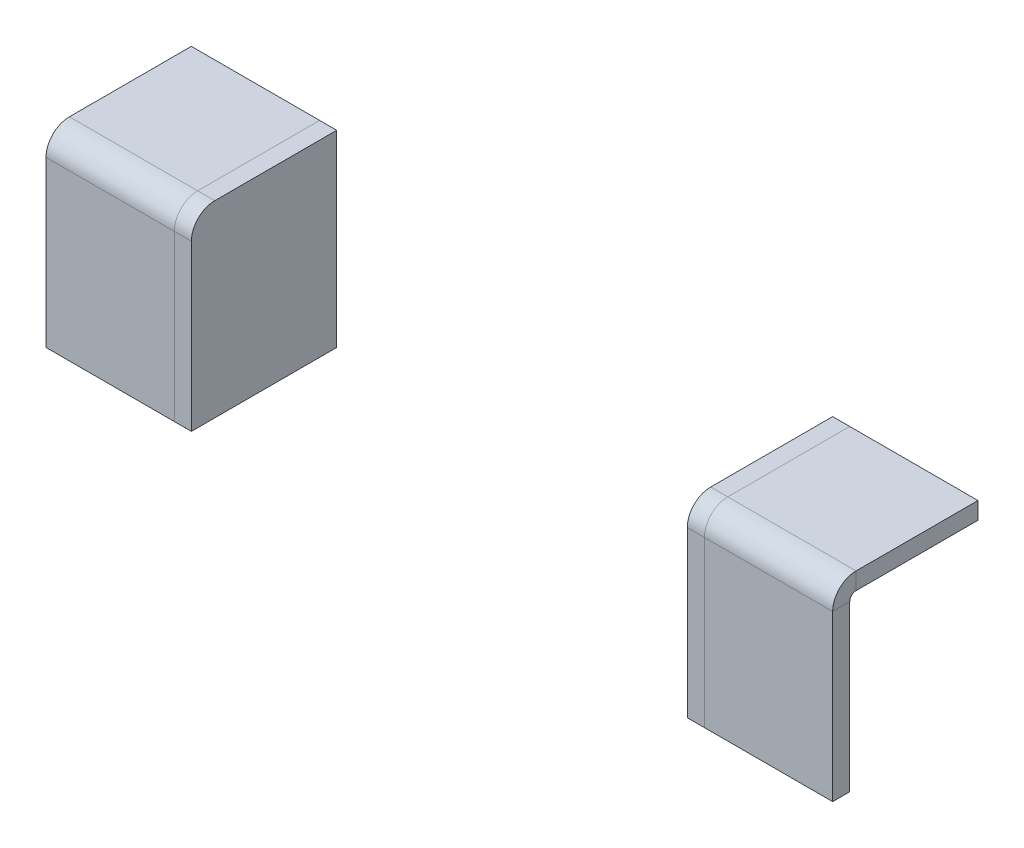
ISO-10303-21;
HEADER;
FILE_DESCRIPTION(('STEP AP214'),'2;1');
FILE_NAME('part.step','',(''),(''),'','','');
FILE_SCHEMA(('AUTOMOTIVE_DESIGN { 1 0 10303 214 1 1 1 1 }'));
ENDSEC;
DATA;
#1=APPLICATION_CONTEXT('core data for automotive mechanical design processes');
#2=APPLICATION_PROTOCOL_DEFINITION('international standard','automotive_design',2000,#1);
#3=PRODUCT_CONTEXT('',#1,'mechanical');
#4=PRODUCT('Part','Part','',(#3));
#5=PRODUCT_RELATED_PRODUCT_CATEGORY('part','',(#4));
#6=PRODUCT_DEFINITION_FORMATION('','',#4);
#7=PRODUCT_DEFINITION_CONTEXT('part definition',#1,'design');
#8=PRODUCT_DEFINITION('design','',#6,#7);
#9=PRODUCT_DEFINITION_SHAPE('','',#8);
#10=(LENGTH_UNIT() NAMED_UNIT(*) SI_UNIT(.MILLI.,.METRE.));
#11=(NAMED_UNIT(*) PLANE_ANGLE_UNIT() SI_UNIT($,.RADIAN.));
#12=(NAMED_UNIT(*) SI_UNIT($,.STERADIAN.) SOLID_ANGLE_UNIT());
#13=UNCERTAINTY_MEASURE_WITH_UNIT(LENGTH_MEASURE(1.E-05),#10,'distance_accuracy_value','');
#14=(GEOMETRIC_REPRESENTATION_CONTEXT(3) GLOBAL_UNCERTAINTY_ASSIGNED_CONTEXT((#13)) GLOBAL_UNIT_ASSIGNED_CONTEXT((#10,
#11,#12)) REPRESENTATION_CONTEXT('',''));
#15=CARTESIAN_POINT('',(0.,0.,0.));
#16=DIRECTION('',(0.,0.,1.));
#17=DIRECTION('',(1.,0.,0.));
#18=AXIS2_PLACEMENT_3D('',#15,#16,#17);
#19=CARTESIAN_POINT('',(67.5,-22.,8.50000000000007));
#20=DIRECTION('',(0.,1.,0.));
#21=DIRECTION('',(0.,0.,1.));
#22=AXIS2_PLACEMENT_3D('',#19,#20,#21);
#23=PLANE('',#22);
#24=DIRECTION('',(0.,0.,-1.));
#25=VECTOR('',#24,1.);
#26=CARTESIAN_POINT('',(69.5,-22.,8.50000000000007));
#27=LINE('',#26,#25);
#28=CARTESIAN_POINT('',(69.5,-22.,8.50000000000007));
#29=VERTEX_POINT('',#28);
#30=CARTESIAN_POINT('',(69.5,-22.,-8.5));
#31=VERTEX_POINT('',#30);
#32=EDGE_CURVE('E144',#29,#31,#27,.T.);
#33=ORIENTED_EDGE('',*,*,#32,.F.);
#34=DIRECTION('',(1.,0.,0.));
#35=VECTOR('',#34,1.);
#36=CARTESIAN_POINT('',(67.5,-22.,8.50000000000007));
#37=LINE('',#36,#35);
#38=CARTESIAN_POINT('',(67.5,-22.,8.50000000000007));
#39=VERTEX_POINT('',#38);
#40=EDGE_CURVE('E143',#39,#29,#37,.T.);
#41=ORIENTED_EDGE('',*,*,#40,.F.);
#42=DIRECTION('',(0.,0.,-1.));
#43=VECTOR('',#42,1.);
#44=CARTESIAN_POINT('',(67.5,-22.,8.50000000000007));
#45=LINE('',#44,#43);
#46=CARTESIAN_POINT('',(67.5,-22.,-8.5));
#47=VERTEX_POINT('',#46);
#48=EDGE_CURVE('E138',#39,#47,#45,.T.);
#49=ORIENTED_EDGE('',*,*,#48,.T.);
#50=DIRECTION('',(1.,0.,0.));
#51=VECTOR('',#50,1.);
#52=CARTESIAN_POINT('',(67.5,-22.,-8.5));
#53=LINE('',#52,#51);
#54=EDGE_CURVE('E14',#47,#31,#53,.T.);
#55=ORIENTED_EDGE('',*,*,#54,.T.);
#56=EDGE_LOOP('',(#33,#41,#49,#55));
#57=FACE_BOUND('',#56,.T.);
#58=ADVANCED_FACE('F69',(#57),#23,.F.);
#59=CARTESIAN_POINT('',(67.5,-22.,-8.5));
#60=DIRECTION('',(0.,0.,1.));
#61=DIRECTION('',(-1.,0.,0.));
#62=AXIS2_PLACEMENT_3D('',#59,#60,#61);
#63=PLANE('',#62);
#64=DIRECTION('',(0.,1.,0.));
#65=VECTOR('',#64,1.);
#66=CARTESIAN_POINT('',(69.5,-22.,-8.5));
#67=LINE('',#66,#65);
#68=CARTESIAN_POINT('',(69.5,0.,-8.5));
#69=VERTEX_POINT('',#68);
#70=EDGE_CURVE('E146',#31,#69,#67,.T.);
#71=ORIENTED_EDGE('',*,*,#70,.F.);
#72=ORIENTED_EDGE('',*,*,#54,.F.);
#73=DIRECTION('',(0.,1.,0.));
#74=VECTOR('',#73,1.);
#75=CARTESIAN_POINT('',(67.5,-22.,-8.5));
#76=LINE('',#75,#74);
#77=CARTESIAN_POINT('',(67.5,0.,-8.5));
#78=VERTEX_POINT('',#77);
#79=EDGE_CURVE('E114',#47,#78,#76,.T.);
#80=ORIENTED_EDGE('',*,*,#79,.T.);
#81=DIRECTION('',(1.,0.,0.));
#82=VECTOR('',#81,1.);
#83=CARTESIAN_POINT('',(67.5,0.,-8.5));
#84=LINE('',#83,#82);
#85=EDGE_CURVE('E77',#78,#69,#84,.T.);
#86=ORIENTED_EDGE('',*,*,#85,.T.);
#87=EDGE_LOOP('',(#71,#72,#80,#86));
#88=FACE_BOUND('',#87,.T.);
#89=ADVANCED_FACE('F155',(#88),#63,.F.);
#90=CARTESIAN_POINT('',(67.5,0.,5.7634));
#91=DIRECTION('',(0.,-1.,0.));
#92=DIRECTION('',(0.,0.,-1.));
#93=AXIS2_PLACEMENT_3D('',#90,#91,#92);
#94=PLANE('',#93);
#95=DIRECTION('',(0.,0.,1.));
#96=VECTOR('',#95,1.);
#97=CARTESIAN_POINT('',(69.5,0.,5.7634));
#98=LINE('',#97,#96);
#99=CARTESIAN_POINT('',(69.5,0.,5.7634));
#100=VERTEX_POINT('',#99);
#101=EDGE_CURVE('E149',#69,#100,#98,.T.);
#102=ORIENTED_EDGE('',*,*,#101,.F.);
#103=ORIENTED_EDGE('',*,*,#85,.F.);
#104=DIRECTION('',(0.,0.,1.));
#105=VECTOR('',#104,1.);
#106=CARTESIAN_POINT('',(67.5,0.,5.7634));
#107=LINE('',#106,#105);
#108=CARTESIAN_POINT('',(67.5,0.,5.7634));
#109=VERTEX_POINT('',#108);
#110=EDGE_CURVE('E123',#78,#109,#107,.T.);
#111=ORIENTED_EDGE('',*,*,#110,.T.);
#112=DIRECTION('',(1.,0.,0.));
#113=VECTOR('',#112,1.);
#114=CARTESIAN_POINT('',(67.5,0.,5.7634));
#115=LINE('',#114,#113);
#116=EDGE_CURVE('E128',#109,#100,#115,.T.);
#117=ORIENTED_EDGE('',*,*,#116,.T.);
#118=EDGE_LOOP('',(#102,#103,#111,#117));
#119=FACE_BOUND('',#118,.T.);
#120=ADVANCED_FACE('F135',(#119),#94,.F.);
#121=CARTESIAN_POINT('',(67.5,-2.7366,5.7634));
#122=DIRECTION('',(1.,0.,0.));
#123=DIRECTION('',(0.,0.,1.));
#124=AXIS2_PLACEMENT_3D('',#121,#122,#123);
#125=CYLINDRICAL_SURFACE('',#124,2.7366);
#126=CARTESIAN_POINT('',(69.5,-2.7366,5.7634));
#127=DIRECTION('',(1.,0.,0.));
#128=DIRECTION('',(0.,0.,-1.));
#129=AXIS2_PLACEMENT_3D('',#126,#127,#128);
#130=CIRCLE('',#129,2.7366);
#131=CARTESIAN_POINT('',(69.5,-2.73659999999999,8.5));
#132=VERTEX_POINT('',#131);
#133=EDGE_CURVE('E130',#100,#132,#130,.T.);
#134=ORIENTED_EDGE('',*,*,#133,.F.);
#135=ORIENTED_EDGE('',*,*,#116,.F.);
#136=CARTESIAN_POINT('',(67.5,-2.7366,5.7634));
#137=DIRECTION('',(1.,0.,0.));
#138=DIRECTION('',(0.,0.,-1.));
#139=AXIS2_PLACEMENT_3D('',#136,#137,#138);
#140=CIRCLE('',#139,2.7366);
#141=CARTESIAN_POINT('',(67.5,-2.73659999999999,8.5));
#142=VERTEX_POINT('',#141);
#143=EDGE_CURVE('E119',#109,#142,#140,.T.);
#144=ORIENTED_EDGE('',*,*,#143,.T.);
#145=DIRECTION('',(1.,0.,0.));
#146=VECTOR('',#145,1.);
#147=CARTESIAN_POINT('',(67.5,-2.73659999999999,8.5));
#148=LINE('',#147,#146);
#149=EDGE_CURVE('E133',#142,#132,#148,.T.);
#150=ORIENTED_EDGE('',*,*,#149,.T.);
#151=EDGE_LOOP('',(#134,#135,#144,#150));
#152=FACE_BOUND('',#151,.T.);
#153=ADVANCED_FACE('F129',(#152),#125,.T.);
#154=CARTESIAN_POINT('',(67.5,-22.,8.50000000000007));
#155=DIRECTION('',(0.,0.,-1.));
#156=DIRECTION('',(0.,1.,0.));
#157=AXIS2_PLACEMENT_3D('',#154,#155,#156);
#158=PLANE('',#157);
#159=DIRECTION('',(0.,-1.,0.));
#160=VECTOR('',#159,1.);
#161=CARTESIAN_POINT('',(69.5,-22.,8.50000000000007));
#162=LINE('',#161,#160);
#163=EDGE_CURVE('E102',#132,#29,#162,.T.);
#164=ORIENTED_EDGE('',*,*,#163,.F.);
#165=ORIENTED_EDGE('',*,*,#149,.F.);
#166=DIRECTION('',(0.,-1.,0.));
#167=VECTOR('',#166,1.);
#168=CARTESIAN_POINT('',(67.5,-22.,8.50000000000007));
#169=LINE('',#168,#167);
#170=EDGE_CURVE('E85',#142,#39,#169,.T.);
#171=ORIENTED_EDGE('',*,*,#170,.T.);
#172=ORIENTED_EDGE('',*,*,#40,.T.);
#173=EDGE_LOOP('',(#164,#165,#171,#172));
#174=FACE_BOUND('',#173,.T.);
#175=ADVANCED_FACE('F161',(#174),#158,.F.);
#176=CARTESIAN_POINT('',(67.5,-2.7366,5.7634));
#177=DIRECTION('',(-1.,0.,0.));
#178=DIRECTION('',(0.,0.,-1.));
#179=AXIS2_PLACEMENT_3D('',#176,#177,#178);
#180=PLANE('',#179);
#181=ORIENTED_EDGE('',*,*,#48,.F.);
#182=ORIENTED_EDGE('',*,*,#170,.F.);
#183=ORIENTED_EDGE('',*,*,#143,.F.);
#184=ORIENTED_EDGE('',*,*,#110,.F.);
#185=ORIENTED_EDGE('',*,*,#79,.F.);
#186=EDGE_LOOP('',(#181,#182,#183,#184,#185));
#187=FACE_BOUND('',#186,.T.);
#188=ADVANCED_FACE('F121',(#187),#180,.T.);
#189=CARTESIAN_POINT('',(69.5,-2.7366,5.7634));
#190=DIRECTION('',(-1.,0.,0.));
#191=DIRECTION('',(0.,0.,-1.));
#192=AXIS2_PLACEMENT_3D('',#189,#190,#191);
#193=PLANE('',#192);
#194=ORIENTED_EDGE('',*,*,#32,.T.);
#195=ORIENTED_EDGE('',*,*,#70,.T.);
#196=ORIENTED_EDGE('',*,*,#101,.T.);
#197=ORIENTED_EDGE('',*,*,#133,.T.);
#198=ORIENTED_EDGE('',*,*,#163,.T.);
#199=EDGE_LOOP('',(#194,#195,#196,#197,#198));
#200=FACE_BOUND('',#199,.T.);
#201=ADVANCED_FACE('F156',(#200),#193,.F.);
#202=CLOSED_SHELL('',(#58,#89,#120,#153,#175,#188,#201));
#203=MANIFOLD_SOLID_BREP('B2',#202);
#204=CARTESIAN_POINT('',(84.5,-2.,8.5));
#205=DIRECTION('',(1.,0.,0.));
#206=DIRECTION('',(0.,0.,1.));
#207=AXIS2_PLACEMENT_3D('',#204,#205,#206);
#208=PLANE('',#207);
#209=DIRECTION('',(0.,0.,1.));
#210=VECTOR('',#209,1.);
#211=CARTESIAN_POINT('',(84.5,-2.,8.5));
#212=LINE('',#211,#210);
#213=CARTESIAN_POINT('',(84.5,-2.,-8.5));
#214=VERTEX_POINT('',#213);
#215=CARTESIAN_POINT('',(84.5,-2.,5.7634));
#216=VERTEX_POINT('',#215);
#217=EDGE_CURVE('E377',#214,#216,#212,.T.);
#218=ORIENTED_EDGE('',*,*,#217,.F.);
#219=DIRECTION('',(0.,1.,0.));
#220=VECTOR('',#219,1.);
#221=CARTESIAN_POINT('',(84.5,-2.,-8.5));
#222=LINE('',#221,#220);
#223=CARTESIAN_POINT('',(84.5,0.,-8.5));
#224=VERTEX_POINT('',#223);
#225=EDGE_CURVE('E67',#214,#224,#222,.T.);
#226=ORIENTED_EDGE('',*,*,#225,.T.);
#227=DIRECTION('',(0.,0.,1.));
#228=VECTOR('',#227,1.);
#229=CARTESIAN_POINT('',(84.5,0.,8.5));
#230=LINE('',#229,#228);
#231=CARTESIAN_POINT('',(84.5,0.,5.7634));
#232=VERTEX_POINT('',#231);
#233=EDGE_CURVE('E375',#224,#232,#230,.T.);
#234=ORIENTED_EDGE('',*,*,#233,.T.);
#235=DIRECTION('',(0.,1.,0.));
#236=VECTOR('',#235,1.);
#237=CARTESIAN_POINT('',(84.5,-2.,5.7634));
#238=LINE('',#237,#236);
#239=EDGE_CURVE('E359',#216,#232,#238,.T.);
#240=ORIENTED_EDGE('',*,*,#239,.F.);
#241=EDGE_LOOP('',(#218,#226,#234,#240));
#242=FACE_BOUND('',#241,.T.);
#243=ADVANCED_FACE('F242',(#242),#208,.T.);
#244=CARTESIAN_POINT('',(77.,-2.,0.));
#245=DIRECTION('',(0.,-1.,0.));
#246=DIRECTION('',(0.,0.,-1.));
#247=AXIS2_PLACEMENT_3D('',#244,#245,#246);
#248=PLANE('',#247);
#249=DIRECTION('',(0.,0.,-1.));
#250=VECTOR('',#249,1.);
#251=CARTESIAN_POINT('',(69.5,-2.,8.5));
#252=LINE('',#251,#250);
#253=CARTESIAN_POINT('',(69.5,-2.,5.7634));
#254=VERTEX_POINT('',#253);
#255=CARTESIAN_POINT('',(69.5,-2.,-8.5));
#256=VERTEX_POINT('',#255);
#257=EDGE_CURVE('E371',#254,#256,#252,.T.);
#258=ORIENTED_EDGE('',*,*,#257,.T.);
#259=DIRECTION('',(1.,0.,0.));
#260=VECTOR('',#259,1.);
#261=CARTESIAN_POINT('',(84.5,-2.,-8.5));
#262=LINE('',#261,#260);
#263=EDGE_CURVE('E374',#256,#214,#262,.T.);
#264=ORIENTED_EDGE('',*,*,#263,.T.);
#265=ORIENTED_EDGE('',*,*,#217,.T.);
#266=DIRECTION('',(1.,0.,0.));
#267=VECTOR('',#266,1.);
#268=CARTESIAN_POINT('',(84.5,-2.,5.7634));
#269=LINE('',#268,#267);
#270=EDGE_CURVE('E362',#216,#254,#269,.F.);
#271=ORIENTED_EDGE('',*,*,#270,.T.);
#272=EDGE_LOOP('',(#258,#264,#265,#271));
#273=FACE_BOUND('',#272,.T.);
#274=ADVANCED_FACE('F409',(#273),#248,.T.);
#275=CARTESIAN_POINT('',(77.,0.,0.));
#276=DIRECTION('',(0.,-1.,0.));
#277=DIRECTION('',(0.,0.,-1.));
#278=AXIS2_PLACEMENT_3D('',#275,#276,#277);
#279=PLANE('',#278);
#280=DIRECTION('',(1.,0.,0.));
#281=VECTOR('',#280,1.);
#282=CARTESIAN_POINT('',(84.5,0.,5.7634));
#283=LINE('',#282,#281);
#284=CARTESIAN_POINT('',(69.5,0.,5.7634));
#285=VERTEX_POINT('',#284);
#286=EDGE_CURVE('E353',#232,#285,#283,.F.);
#287=ORIENTED_EDGE('',*,*,#286,.F.);
#288=ORIENTED_EDGE('',*,*,#233,.F.);
#289=DIRECTION('',(1.,0.,0.));
#290=VECTOR('',#289,1.);
#291=CARTESIAN_POINT('',(84.5,0.,-8.5));
#292=LINE('',#291,#290);
#293=CARTESIAN_POINT('',(69.5,0.,-8.5));
#294=VERTEX_POINT('',#293);
#295=EDGE_CURVE('E382',#294,#224,#292,.T.);
#296=ORIENTED_EDGE('',*,*,#295,.F.);
#297=DIRECTION('',(0.,0.,-1.));
#298=VECTOR('',#297,1.);
#299=CARTESIAN_POINT('',(69.5,0.,8.5));
#300=LINE('',#299,#298);
#301=EDGE_CURVE('E369',#285,#294,#300,.T.);
#302=ORIENTED_EDGE('',*,*,#301,.F.);
#303=EDGE_LOOP('',(#287,#288,#296,#302));
#304=FACE_BOUND('',#303,.T.);
#305=ADVANCED_FACE('F393',(#304),#279,.F.);
#306=CARTESIAN_POINT('',(69.5,-2.,8.5));
#307=DIRECTION('',(-1.,0.,0.));
#308=DIRECTION('',(0.,0.,-1.));
#309=AXIS2_PLACEMENT_3D('',#306,#307,#308);
#310=PLANE('',#309);
#311=DIRECTION('',(0.,1.,0.));
#312=VECTOR('',#311,1.);
#313=CARTESIAN_POINT('',(69.5,-2.,5.7634));
#314=LINE('',#313,#312);
#315=EDGE_CURVE('E366',#254,#285,#314,.T.);
#316=ORIENTED_EDGE('',*,*,#315,.T.);
#317=ORIENTED_EDGE('',*,*,#301,.T.);
#318=DIRECTION('',(0.,1.,0.));
#319=VECTOR('',#318,1.);
#320=CARTESIAN_POINT('',(69.5,-2.,-8.5));
#321=LINE('',#320,#319);
#322=EDGE_CURVE('E246',#256,#294,#321,.T.);
#323=ORIENTED_EDGE('',*,*,#322,.F.);
#324=ORIENTED_EDGE('',*,*,#257,.F.);
#325=EDGE_LOOP('',(#316,#317,#323,#324));
#326=FACE_BOUND('',#325,.T.);
#327=ADVANCED_FACE('F244',(#326),#310,.T.);
#328=CARTESIAN_POINT('',(84.5,-2.,-8.5));
#329=DIRECTION('',(0.,0.,-1.));
#330=DIRECTION('',(1.,0.,0.));
#331=AXIS2_PLACEMENT_3D('',#328,#329,#330);
#332=PLANE('',#331);
#333=ORIENTED_EDGE('',*,*,#295,.T.);
#334=ORIENTED_EDGE('',*,*,#225,.F.);
#335=ORIENTED_EDGE('',*,*,#263,.F.);
#336=ORIENTED_EDGE('',*,*,#322,.T.);
#337=EDGE_LOOP('',(#333,#334,#335,#336));
#338=FACE_BOUND('',#337,.T.);
#339=ADVANCED_FACE('F412',(#338),#332,.T.);
#340=CARTESIAN_POINT('',(69.5,-2.7366,5.7634));
#341=DIRECTION('',(-1.,0.,0.));
#342=DIRECTION('',(0.,0.,-1.));
#343=AXIS2_PLACEMENT_3D('',#340,#341,#342);
#344=PLANE('',#343);
#345=DIRECTION('',(0.,0.,-1.));
#346=VECTOR('',#345,1.);
#347=CARTESIAN_POINT('',(69.5,-2.7366,8.5));
#348=LINE('',#347,#346);
#349=CARTESIAN_POINT('',(69.5,-2.73659999999999,6.5));
#350=VERTEX_POINT('',#349);
#351=CARTESIAN_POINT('',(69.5,-2.73659999999999,8.5));
#352=VERTEX_POINT('',#351);
#353=EDGE_CURVE('E350',#350,#352,#348,.F.);
#354=ORIENTED_EDGE('',*,*,#353,.T.);
#355=CARTESIAN_POINT('',(69.5,-2.7366,5.7634));
#356=DIRECTION('',(-1.,0.,0.));
#357=DIRECTION('',(0.,0.,1.));
#358=AXIS2_PLACEMENT_3D('',#355,#356,#357);
#359=CIRCLE('',#358,2.7366);
#360=EDGE_CURVE('E356',#285,#352,#359,.F.);
#361=ORIENTED_EDGE('',*,*,#360,.F.);
#362=ORIENTED_EDGE('',*,*,#315,.F.);
#363=CARTESIAN_POINT('',(69.5,-2.7366,5.7634));
#364=DIRECTION('',(-1.,0.,0.));
#365=DIRECTION('',(0.,0.,1.));
#366=AXIS2_PLACEMENT_3D('',#363,#364,#365);
#367=CIRCLE('',#366,0.7366);
#368=EDGE_CURVE('E264',#254,#350,#367,.F.);
#369=ORIENTED_EDGE('',*,*,#368,.T.);
#370=EDGE_LOOP('',(#354,#361,#362,#369));
#371=FACE_BOUND('',#370,.T.);
#372=ADVANCED_FACE('F405',(#371),#344,.T.);
#373=CARTESIAN_POINT('',(84.5,-2.7366,5.7634));
#374=DIRECTION('',(-1.,0.,0.));
#375=DIRECTION('',(0.,0.,-1.));
#376=AXIS2_PLACEMENT_3D('',#373,#374,#375);
#377=PLANE('',#376);
#378=CARTESIAN_POINT('',(84.5,-2.7366,5.7634));
#379=DIRECTION('',(-1.,0.,0.));
#380=DIRECTION('',(0.,0.,1.));
#381=AXIS2_PLACEMENT_3D('',#378,#379,#380);
#382=CIRCLE('',#381,0.7366);
#383=CARTESIAN_POINT('',(84.5,-2.73659999999999,6.5));
#384=VERTEX_POINT('',#383);
#385=EDGE_CURVE('E257',#384,#216,#382,.T.);
#386=ORIENTED_EDGE('',*,*,#385,.T.);
#387=ORIENTED_EDGE('',*,*,#239,.T.);
#388=CARTESIAN_POINT('',(84.5,-2.7366,5.7634));
#389=DIRECTION('',(-1.,0.,0.));
#390=DIRECTION('',(0.,0.,1.));
#391=AXIS2_PLACEMENT_3D('',#388,#389,#390);
#392=CIRCLE('',#391,2.7366);
#393=CARTESIAN_POINT('',(84.5,-2.7366,8.5));
#394=VERTEX_POINT('',#393);
#395=EDGE_CURVE('E357',#394,#232,#392,.T.);
#396=ORIENTED_EDGE('',*,*,#395,.F.);
#397=DIRECTION('',(0.,0.,-1.));
#398=VECTOR('',#397,1.);
#399=CARTESIAN_POINT('',(84.5,-2.7366,6.5));
#400=LINE('',#399,#398);
#401=EDGE_CURVE('E344',#384,#394,#400,.F.);
#402=ORIENTED_EDGE('',*,*,#401,.F.);
#403=EDGE_LOOP('',(#386,#387,#396,#402));
#404=FACE_BOUND('',#403,.T.);
#405=ADVANCED_FACE('F397',(#404),#377,.F.);
#406=CARTESIAN_POINT('',(84.5,-2.7366,5.7634));
#407=DIRECTION('',(1.,0.,0.));
#408=DIRECTION('',(0.,0.,1.));
#409=AXIS2_PLACEMENT_3D('',#406,#407,#408);
#410=CYLINDRICAL_SURFACE('',#409,2.7366);
#411=ORIENTED_EDGE('',*,*,#286,.T.);
#412=ORIENTED_EDGE('',*,*,#360,.T.);
#413=DIRECTION('',(1.,0.,0.));
#414=VECTOR('',#413,1.);
#415=CARTESIAN_POINT('',(69.5,-2.7366,8.5));
#416=LINE('',#415,#414);
#417=EDGE_CURVE('E326',#394,#352,#416,.F.);
#418=ORIENTED_EDGE('',*,*,#417,.F.);
#419=ORIENTED_EDGE('',*,*,#395,.T.);
#420=EDGE_LOOP('',(#411,#412,#418,#419));
#421=FACE_BOUND('',#420,.T.);
#422=ADVANCED_FACE('F398',(#421),#410,.T.);
#423=CARTESIAN_POINT('',(84.5,-2.7366,5.7634));
#424=DIRECTION('',(1.,0.,0.));
#425=DIRECTION('',(0.,0.,1.));
#426=AXIS2_PLACEMENT_3D('',#423,#424,#425);
#427=CYLINDRICAL_SURFACE('',#426,0.7366);
#428=ORIENTED_EDGE('',*,*,#270,.F.);
#429=ORIENTED_EDGE('',*,*,#385,.F.);
#430=DIRECTION('',(1.,0.,0.));
#431=VECTOR('',#430,1.);
#432=CARTESIAN_POINT('',(69.5,-2.7366,6.5));
#433=LINE('',#432,#431);
#434=EDGE_CURVE('E347',#350,#384,#433,.T.);
#435=ORIENTED_EDGE('',*,*,#434,.F.);
#436=ORIENTED_EDGE('',*,*,#368,.F.);
#437=EDGE_LOOP('',(#428,#429,#435,#436));
#438=FACE_BOUND('',#437,.T.);
#439=ADVANCED_FACE('F403',(#438),#427,.F.);
#440=CARTESIAN_POINT('',(84.5,-22.,8.50000000000007));
#441=DIRECTION('',(-1.,0.,0.));
#442=DIRECTION('',(0.,1.,0.));
#443=AXIS2_PLACEMENT_3D('',#440,#441,#442);
#444=PLANE('',#443);
#445=ORIENTED_EDGE('',*,*,#401,.T.);
#446=DIRECTION('',(0.,-1.,0.));
#447=VECTOR('',#446,1.);
#448=CARTESIAN_POINT('',(84.5,0.,8.49999999999999));
#449=LINE('',#448,#447);
#450=CARTESIAN_POINT('',(84.5,-22.,8.50000000000007));
#451=VERTEX_POINT('',#450);
#452=EDGE_CURVE('E321',#394,#451,#449,.T.);
#453=ORIENTED_EDGE('',*,*,#452,.T.);
#454=DIRECTION('',(0.,0.,-1.));
#455=VECTOR('',#454,1.);
#456=CARTESIAN_POINT('',(84.5,-22.,8.50000000000007));
#457=LINE('',#456,#455);
#458=CARTESIAN_POINT('',(84.5,-22.,6.50000000000007));
#459=VERTEX_POINT('',#458);
#460=EDGE_CURVE('E317',#451,#459,#457,.T.);
#461=ORIENTED_EDGE('',*,*,#460,.T.);
#462=DIRECTION('',(0.,1.,0.));
#463=VECTOR('',#462,1.);
#464=CARTESIAN_POINT('',(84.5,-22.,6.50000000000007));
#465=LINE('',#464,#463);
#466=EDGE_CURVE('E340',#384,#459,#465,.F.);
#467=ORIENTED_EDGE('',*,*,#466,.F.);
#468=EDGE_LOOP('',(#445,#453,#461,#467));
#469=FACE_BOUND('',#468,.T.);
#470=ADVANCED_FACE('F400',(#469),#444,.F.);
#471=CARTESIAN_POINT('',(69.5,-1.99999999999999,8.5));
#472=DIRECTION('',(1.,0.,0.));
#473=DIRECTION('',(0.,-1.,0.));
#474=AXIS2_PLACEMENT_3D('',#471,#472,#473);
#475=PLANE('',#474);
#476=ORIENTED_EDGE('',*,*,#353,.F.);
#477=DIRECTION('',(0.,-1.,0.));
#478=VECTOR('',#477,1.);
#479=CARTESIAN_POINT('',(69.5,-2.,6.5));
#480=LINE('',#479,#478);
#481=CARTESIAN_POINT('',(69.5,-22.,6.50000000000007));
#482=VERTEX_POINT('',#481);
#483=EDGE_CURVE('E332',#482,#350,#480,.F.);
#484=ORIENTED_EDGE('',*,*,#483,.F.);
#485=DIRECTION('',(0.,0.,-1.));
#486=VECTOR('',#485,1.);
#487=CARTESIAN_POINT('',(69.5,-22.,8.50000000000007));
#488=LINE('',#487,#486);
#489=CARTESIAN_POINT('',(69.5,-22.,8.50000000000007));
#490=VERTEX_POINT('',#489);
#491=EDGE_CURVE('E314',#490,#482,#488,.T.);
#492=ORIENTED_EDGE('',*,*,#491,.F.);
#493=DIRECTION('',(0.,1.,0.));
#494=VECTOR('',#493,1.);
#495=CARTESIAN_POINT('',(69.5,0.,8.49999999999999));
#496=LINE('',#495,#494);
#497=EDGE_CURVE('E320',#490,#352,#496,.T.);
#498=ORIENTED_EDGE('',*,*,#497,.T.);
#499=EDGE_LOOP('',(#476,#484,#492,#498));
#500=FACE_BOUND('',#499,.T.);
#501=ADVANCED_FACE('F331',(#500),#475,.F.);
#502=CARTESIAN_POINT('',(77.,0.,8.49999999999999));
#503=DIRECTION('',(0.,0.,-1.));
#504=DIRECTION('',(0.,1.,0.));
#505=AXIS2_PLACEMENT_3D('',#502,#503,#504);
#506=PLANE('',#505);
#507=ORIENTED_EDGE('',*,*,#417,.T.);
#508=ORIENTED_EDGE('',*,*,#497,.F.);
#509=DIRECTION('',(-1.,0.,0.));
#510=VECTOR('',#509,1.);
#511=CARTESIAN_POINT('',(77.,-22.,8.50000000000007));
#512=LINE('',#511,#510);
#513=EDGE_CURVE('E310',#451,#490,#512,.T.);
#514=ORIENTED_EDGE('',*,*,#513,.F.);
#515=ORIENTED_EDGE('',*,*,#452,.F.);
#516=EDGE_LOOP('',(#507,#508,#514,#515));
#517=FACE_BOUND('',#516,.T.);
#518=ADVANCED_FACE('F324',(#517),#506,.F.);
#519=CARTESIAN_POINT('',(77.,0.,6.49999999999999));
#520=DIRECTION('',(0.,0.,-1.));
#521=DIRECTION('',(0.,1.,0.));
#522=AXIS2_PLACEMENT_3D('',#519,#520,#521);
#523=PLANE('',#522);
#524=ORIENTED_EDGE('',*,*,#466,.T.);
#525=DIRECTION('',(1.,0.,0.));
#526=VECTOR('',#525,1.);
#527=CARTESIAN_POINT('',(69.5,-22.,6.50000000000007));
#528=LINE('',#527,#526);
#529=EDGE_CURVE('E338',#459,#482,#528,.F.);
#530=ORIENTED_EDGE('',*,*,#529,.T.);
#531=ORIENTED_EDGE('',*,*,#483,.T.);
#532=ORIENTED_EDGE('',*,*,#434,.T.);
#533=EDGE_LOOP('',(#524,#530,#531,#532));
#534=FACE_BOUND('',#533,.T.);
#535=ADVANCED_FACE('F402',(#534),#523,.T.);
#536=CARTESIAN_POINT('',(69.5,-22.,8.50000000000007));
#537=DIRECTION('',(0.,1.,0.));
#538=DIRECTION('',(0.,0.,1.));
#539=AXIS2_PLACEMENT_3D('',#536,#537,#538);
#540=PLANE('',#539);
#541=ORIENTED_EDGE('',*,*,#529,.F.);
#542=ORIENTED_EDGE('',*,*,#460,.F.);
#543=ORIENTED_EDGE('',*,*,#513,.T.);
#544=ORIENTED_EDGE('',*,*,#491,.T.);
#545=EDGE_LOOP('',(#541,#542,#543,#544));
#546=FACE_BOUND('',#545,.T.);
#547=ADVANCED_FACE('F312',(#546),#540,.F.);
#548=CLOSED_SHELL('',(#243,#274,#305,#327,#339,#372,#405,#422,#439,#470,#501,#518,#535,#547));
#549=MANIFOLD_SOLID_BREP('B8',#548);
#550=CARTESIAN_POINT('',(9.5,-22.,8.50000000000007));
#551=DIRECTION('',(0.,1.,0.));
#552=DIRECTION('',(0.,0.,1.));
#553=AXIS2_PLACEMENT_3D('',#550,#551,#552);
#554=PLANE('',#553);
#555=DIRECTION('',(0.,0.,-1.));
#556=VECTOR('',#555,1.);
#557=CARTESIAN_POINT('',(7.5,-22.,8.50000000000007));
#558=LINE('',#557,#556);
#559=CARTESIAN_POINT('',(7.5,-22.,8.50000000000007));
#560=VERTEX_POINT('',#559);
#561=CARTESIAN_POINT('',(7.5,-22.,-8.5));
#562=VERTEX_POINT('',#561);
#563=EDGE_CURVE('E636',#560,#562,#558,.T.);
#564=ORIENTED_EDGE('',*,*,#563,.T.);
#565=DIRECTION('',(-1.,0.,0.));
#566=VECTOR('',#565,1.);
#567=CARTESIAN_POINT('',(9.5,-22.,-8.5));
#568=LINE('',#567,#566);
#569=CARTESIAN_POINT('',(9.5,-22.,-8.5));
#570=VERTEX_POINT('',#569);
#571=EDGE_CURVE('E240',#570,#562,#568,.T.);
#572=ORIENTED_EDGE('',*,*,#571,.F.);
#573=DIRECTION('',(0.,0.,-1.));
#574=VECTOR('',#573,1.);
#575=CARTESIAN_POINT('',(9.5,-22.,8.50000000000007));
#576=LINE('',#575,#574);
#577=CARTESIAN_POINT('',(9.5,-22.,8.50000000000007));
#578=VERTEX_POINT('',#577);
#579=EDGE_CURVE('E644',#578,#570,#576,.T.);
#580=ORIENTED_EDGE('',*,*,#579,.F.);
#581=DIRECTION('',(-1.,0.,0.));
#582=VECTOR('',#581,1.);
#583=CARTESIAN_POINT('',(9.5,-22.,8.50000000000007));
#584=LINE('',#583,#582);
#585=EDGE_CURVE('E632',#578,#560,#584,.T.);
#586=ORIENTED_EDGE('',*,*,#585,.T.);
#587=EDGE_LOOP('',(#564,#572,#580,#586));
#588=FACE_BOUND('',#587,.T.);
#589=ADVANCED_FACE('F562',(#588),#554,.F.);
#590=CARTESIAN_POINT('',(9.5,-22.,-8.5));
#591=DIRECTION('',(0.,0.,1.));
#592=DIRECTION('',(1.,0.,0.));
#593=AXIS2_PLACEMENT_3D('',#590,#591,#592);
#594=PLANE('',#593);
#595=DIRECTION('',(0.,1.,0.));
#596=VECTOR('',#595,1.);
#597=CARTESIAN_POINT('',(7.5,-22.,-8.5));
#598=LINE('',#597,#596);
#599=CARTESIAN_POINT('',(7.5,0.,-8.5));
#600=VERTEX_POINT('',#599);
#601=EDGE_CURVE('E639',#562,#600,#598,.T.);
#602=ORIENTED_EDGE('',*,*,#601,.T.);
#603=DIRECTION('',(-1.,0.,0.));
#604=VECTOR('',#603,1.);
#605=CARTESIAN_POINT('',(9.5,0.,-8.5));
#606=LINE('',#605,#604);
#607=CARTESIAN_POINT('',(9.5,0.,-8.5));
#608=VERTEX_POINT('',#607);
#609=EDGE_CURVE('E570',#608,#600,#606,.T.);
#610=ORIENTED_EDGE('',*,*,#609,.F.);
#611=DIRECTION('',(0.,1.,0.));
#612=VECTOR('',#611,1.);
#613=CARTESIAN_POINT('',(9.5,-22.,-8.5));
#614=LINE('',#613,#612);
#615=EDGE_CURVE('E612',#570,#608,#614,.T.);
#616=ORIENTED_EDGE('',*,*,#615,.F.);
#617=ORIENTED_EDGE('',*,*,#571,.T.);
#618=EDGE_LOOP('',(#602,#610,#616,#617));
#619=FACE_BOUND('',#618,.T.);
#620=ADVANCED_FACE('F663',(#619),#594,.F.);
#621=CARTESIAN_POINT('',(9.5,0.,5.7634));
#622=DIRECTION('',(0.,-1.,0.));
#623=DIRECTION('',(0.,0.,-1.));
#624=AXIS2_PLACEMENT_3D('',#621,#622,#623);
#625=PLANE('',#624);
#626=DIRECTION('',(0.,0.,1.));
#627=VECTOR('',#626,1.);
#628=CARTESIAN_POINT('',(7.5,0.,5.7634));
#629=LINE('',#628,#627);
#630=CARTESIAN_POINT('',(7.5,0.,5.7634));
#631=VERTEX_POINT('',#630);
#632=EDGE_CURVE('E627',#600,#631,#629,.T.);
#633=ORIENTED_EDGE('',*,*,#632,.T.);
#634=DIRECTION('',(-1.,0.,0.));
#635=VECTOR('',#634,1.);
#636=CARTESIAN_POINT('',(9.5,0.,5.7634));
#637=LINE('',#636,#635);
#638=CARTESIAN_POINT('',(9.5,0.,5.7634));
#639=VERTEX_POINT('',#638);
#640=EDGE_CURVE('E624',#639,#631,#637,.T.);
#641=ORIENTED_EDGE('',*,*,#640,.F.);
#642=DIRECTION('',(0.,0.,1.));
#643=VECTOR('',#642,1.);
#644=CARTESIAN_POINT('',(9.5,0.,5.7634));
#645=LINE('',#644,#643);
#646=EDGE_CURVE('E616',#608,#639,#645,.T.);
#647=ORIENTED_EDGE('',*,*,#646,.F.);
#648=ORIENTED_EDGE('',*,*,#609,.T.);
#649=EDGE_LOOP('',(#633,#641,#647,#648));
#650=FACE_BOUND('',#649,.T.);
#651=ADVANCED_FACE('F625',(#650),#625,.F.);
#652=CARTESIAN_POINT('',(9.5,-2.7366,5.7634));
#653=DIRECTION('',(-1.,0.,0.));
#654=DIRECTION('',(0.,0.,1.));
#655=AXIS2_PLACEMENT_3D('',#652,#653,#654);
#656=CYLINDRICAL_SURFACE('',#655,2.7366);
#657=CARTESIAN_POINT('',(7.5,-2.7366,5.7634));
#658=DIRECTION('',(1.,0.,0.));
#659=DIRECTION('',(0.,0.,-1.));
#660=AXIS2_PLACEMENT_3D('',#657,#658,#659);
#661=CIRCLE('',#660,2.7366);
#662=CARTESIAN_POINT('',(7.5,-2.73659999999999,8.5));
#663=VERTEX_POINT('',#662);
#664=EDGE_CURVE('E598',#631,#663,#661,.T.);
#665=ORIENTED_EDGE('',*,*,#664,.T.);
#666=DIRECTION('',(-1.,0.,0.));
#667=VECTOR('',#666,1.);
#668=CARTESIAN_POINT('',(9.5,-2.73659999999999,8.5));
#669=LINE('',#668,#667);
#670=CARTESIAN_POINT('',(9.5,-2.73659999999999,8.5));
#671=VERTEX_POINT('',#670);
#672=EDGE_CURVE('E628',#671,#663,#669,.T.);
#673=ORIENTED_EDGE('',*,*,#672,.F.);
#674=CARTESIAN_POINT('',(9.5,-2.7366,5.7634));
#675=DIRECTION('',(1.,0.,0.));
#676=DIRECTION('',(0.,0.,-1.));
#677=AXIS2_PLACEMENT_3D('',#674,#675,#676);
#678=CIRCLE('',#677,2.7366);
#679=EDGE_CURVE('E620',#639,#671,#678,.T.);
#680=ORIENTED_EDGE('',*,*,#679,.F.);
#681=ORIENTED_EDGE('',*,*,#640,.T.);
#682=EDGE_LOOP('',(#665,#673,#680,#681));
#683=FACE_BOUND('',#682,.T.);
#684=ADVANCED_FACE('F630',(#683),#656,.T.);
#685=CARTESIAN_POINT('',(9.5,-22.,8.50000000000007));
#686=DIRECTION('',(0.,0.,-1.));
#687=DIRECTION('',(0.,1.,0.));
#688=AXIS2_PLACEMENT_3D('',#685,#686,#687);
#689=PLANE('',#688);
#690=DIRECTION('',(0.,-1.,0.));
#691=VECTOR('',#690,1.);
#692=CARTESIAN_POINT('',(7.5,-22.,8.50000000000007));
#693=LINE('',#692,#691);
#694=EDGE_CURVE('E604',#663,#560,#693,.T.);
#695=ORIENTED_EDGE('',*,*,#694,.T.);
#696=ORIENTED_EDGE('',*,*,#585,.F.);
#697=DIRECTION('',(0.,-1.,0.));
#698=VECTOR('',#697,1.);
#699=CARTESIAN_POINT('',(9.5,-22.,8.50000000000007));
#700=LINE('',#699,#698);
#701=EDGE_CURVE('E578',#671,#578,#700,.T.);
#702=ORIENTED_EDGE('',*,*,#701,.F.);
#703=ORIENTED_EDGE('',*,*,#672,.T.);
#704=EDGE_LOOP('',(#695,#696,#702,#703));
#705=FACE_BOUND('',#704,.T.);
#706=ADVANCED_FACE('F652',(#705),#689,.F.);
#707=CARTESIAN_POINT('',(9.5,-2.7366,5.7634));
#708=DIRECTION('',(1.,0.,0.));
#709=DIRECTION('',(0.,0.,-1.));
#710=AXIS2_PLACEMENT_3D('',#707,#708,#709);
#711=PLANE('',#710);
#712=ORIENTED_EDGE('',*,*,#579,.T.);
#713=ORIENTED_EDGE('',*,*,#615,.T.);
#714=ORIENTED_EDGE('',*,*,#646,.T.);
#715=ORIENTED_EDGE('',*,*,#679,.T.);
#716=ORIENTED_EDGE('',*,*,#701,.T.);
#717=EDGE_LOOP('',(#712,#713,#714,#715,#716));
#718=FACE_BOUND('',#717,.T.);
#719=ADVANCED_FACE('F618',(#718),#711,.T.);
#720=CARTESIAN_POINT('',(7.5,-2.7366,5.7634));
#721=DIRECTION('',(1.,0.,0.));
#722=DIRECTION('',(0.,0.,-1.));
#723=AXIS2_PLACEMENT_3D('',#720,#721,#722);
#724=PLANE('',#723);
#725=ORIENTED_EDGE('',*,*,#563,.F.);
#726=ORIENTED_EDGE('',*,*,#694,.F.);
#727=ORIENTED_EDGE('',*,*,#664,.F.);
#728=ORIENTED_EDGE('',*,*,#632,.F.);
#729=ORIENTED_EDGE('',*,*,#601,.F.);
#730=EDGE_LOOP('',(#725,#726,#727,#728,#729));
#731=FACE_BOUND('',#730,.T.);
#732=ADVANCED_FACE('F648',(#731),#724,.F.);
#733=CLOSED_SHELL('',(#589,#620,#651,#684,#706,#719,#732));
#734=MANIFOLD_SOLID_BREP('B61',#733);
#735=CARTESIAN_POINT('',(-7.5,-2.,8.5));
#736=DIRECTION('',(-1.,0.,0.));
#737=DIRECTION('',(0.,0.,1.));
#738=AXIS2_PLACEMENT_3D('',#735,#736,#737);
#739=PLANE('',#738);
#740=DIRECTION('',(0.,0.,1.));
#741=VECTOR('',#740,1.);
#742=CARTESIAN_POINT('',(-7.5,-2.,8.5));
#743=LINE('',#742,#741);
#744=CARTESIAN_POINT('',(-7.5,-2.,-8.5));
#745=VERTEX_POINT('',#744);
#746=CARTESIAN_POINT('',(-7.5,-2.,5.7634));
#747=VERTEX_POINT('',#746);
#748=EDGE_CURVE('E858',#745,#747,#743,.T.);
#749=ORIENTED_EDGE('',*,*,#748,.T.);
#750=DIRECTION('',(0.,1.,0.));
#751=VECTOR('',#750,1.);
#752=CARTESIAN_POINT('',(-7.5,-2.,5.7634));
#753=LINE('',#752,#751);
#754=CARTESIAN_POINT('',(-7.5,0.,5.7634));
#755=VERTEX_POINT('',#754);
#756=EDGE_CURVE('E839',#747,#755,#753,.T.);
#757=ORIENTED_EDGE('',*,*,#756,.T.);
#758=DIRECTION('',(0.,0.,1.));
#759=VECTOR('',#758,1.);
#760=CARTESIAN_POINT('',(-7.5,0.,8.5));
#761=LINE('',#760,#759);
#762=CARTESIAN_POINT('',(-7.5,0.,-8.5));
#763=VERTEX_POINT('',#762);
#764=EDGE_CURVE('E855',#763,#755,#761,.T.);
#765=ORIENTED_EDGE('',*,*,#764,.F.);
#766=DIRECTION('',(0.,1.,0.));
#767=VECTOR('',#766,1.);
#768=CARTESIAN_POINT('',(-7.5,-2.,-8.5));
#769=LINE('',#768,#767);
#770=EDGE_CURVE('E560',#745,#763,#769,.T.);
#771=ORIENTED_EDGE('',*,*,#770,.F.);
#772=EDGE_LOOP('',(#749,#757,#765,#771));
#773=FACE_BOUND('',#772,.T.);
#774=ADVANCED_FACE('F725',(#773),#739,.T.);
#775=CARTESIAN_POINT('',(0.,-2.,0.));
#776=DIRECTION('',(0.,-1.,0.));
#777=DIRECTION('',(0.,0.,-1.));
#778=AXIS2_PLACEMENT_3D('',#775,#776,#777);
#779=PLANE('',#778);
#780=DIRECTION('',(0.,0.,-1.));
#781=VECTOR('',#780,1.);
#782=CARTESIAN_POINT('',(7.5,-2.,8.5));
#783=LINE('',#782,#781);
#784=CARTESIAN_POINT('',(7.5,-2.,5.7634));
#785=VERTEX_POINT('',#784);
#786=CARTESIAN_POINT('',(7.5,-2.,-8.5));
#787=VERTEX_POINT('',#786);
#788=EDGE_CURVE('E852',#785,#787,#783,.T.);
#789=ORIENTED_EDGE('',*,*,#788,.F.);
#790=DIRECTION('',(-1.,0.,0.));
#791=VECTOR('',#790,1.);
#792=CARTESIAN_POINT('',(-7.5,-2.,5.7634));
#793=LINE('',#792,#791);
#794=EDGE_CURVE('E740',#747,#785,#793,.F.);
#795=ORIENTED_EDGE('',*,*,#794,.F.);
#796=ORIENTED_EDGE('',*,*,#748,.F.);
#797=DIRECTION('',(-1.,0.,0.));
#798=VECTOR('',#797,1.);
#799=CARTESIAN_POINT('',(-7.5,-2.,-8.5));
#800=LINE('',#799,#798);
#801=EDGE_CURVE('E854',#787,#745,#800,.T.);
#802=ORIENTED_EDGE('',*,*,#801,.F.);
#803=EDGE_LOOP('',(#789,#795,#796,#802));
#804=FACE_BOUND('',#803,.T.);
#805=ADVANCED_FACE('F901',(#804),#779,.T.);
#806=CARTESIAN_POINT('',(0.,0.,0.));
#807=DIRECTION('',(0.,-1.,0.));
#808=DIRECTION('',(0.,0.,-1.));
#809=AXIS2_PLACEMENT_3D('',#806,#807,#808);
#810=PLANE('',#809);
#811=DIRECTION('',(-1.,0.,0.));
#812=VECTOR('',#811,1.);
#813=CARTESIAN_POINT('',(-7.5,0.,5.7634));
#814=LINE('',#813,#812);
#815=CARTESIAN_POINT('',(7.5,0.,5.7634));
#816=VERTEX_POINT('',#815);
#817=EDGE_CURVE('E833',#755,#816,#814,.F.);
#818=ORIENTED_EDGE('',*,*,#817,.T.);
#819=DIRECTION('',(0.,0.,-1.));
#820=VECTOR('',#819,1.);
#821=CARTESIAN_POINT('',(7.5,0.,8.5));
#822=LINE('',#821,#820);
#823=CARTESIAN_POINT('',(7.5,0.,-8.5));
#824=VERTEX_POINT('',#823);
#825=EDGE_CURVE('E850',#816,#824,#822,.T.);
#826=ORIENTED_EDGE('',*,*,#825,.T.);
#827=DIRECTION('',(-1.,0.,0.));
#828=VECTOR('',#827,1.);
#829=CARTESIAN_POINT('',(-7.5,0.,-8.5));
#830=LINE('',#829,#828);
#831=EDGE_CURVE('E861',#824,#763,#830,.T.);
#832=ORIENTED_EDGE('',*,*,#831,.T.);
#833=ORIENTED_EDGE('',*,*,#764,.T.);
#834=EDGE_LOOP('',(#818,#826,#832,#833));
#835=FACE_BOUND('',#834,.T.);
#836=ADVANCED_FACE('F868',(#835),#810,.F.);
#837=CARTESIAN_POINT('',(7.5,-2.,8.5));
#838=DIRECTION('',(1.,0.,0.));
#839=DIRECTION('',(0.,0.,-1.));
#840=AXIS2_PLACEMENT_3D('',#837,#838,#839);
#841=PLANE('',#840);
#842=DIRECTION('',(0.,1.,0.));
#843=VECTOR('',#842,1.);
#844=CARTESIAN_POINT('',(7.5,-2.,5.7634));
#845=LINE('',#844,#843);
#846=EDGE_CURVE('E748',#785,#816,#845,.T.);
#847=ORIENTED_EDGE('',*,*,#846,.F.);
#848=ORIENTED_EDGE('',*,*,#788,.T.);
#849=DIRECTION('',(0.,1.,0.));
#850=VECTOR('',#849,1.);
#851=CARTESIAN_POINT('',(7.5,-2.,-8.5));
#852=LINE('',#851,#850);
#853=EDGE_CURVE('E729',#787,#824,#852,.T.);
#854=ORIENTED_EDGE('',*,*,#853,.T.);
#855=ORIENTED_EDGE('',*,*,#825,.F.);
#856=EDGE_LOOP('',(#847,#848,#854,#855));
#857=FACE_BOUND('',#856,.T.);
#858=ADVANCED_FACE('F727',(#857),#841,.T.);
#859=CARTESIAN_POINT('',(-7.5,-2.,-8.5));
#860=DIRECTION('',(0.,0.,-1.));
#861=DIRECTION('',(-1.,0.,0.));
#862=AXIS2_PLACEMENT_3D('',#859,#860,#861);
#863=PLANE('',#862);
#864=ORIENTED_EDGE('',*,*,#831,.F.);
#865=ORIENTED_EDGE('',*,*,#853,.F.);
#866=ORIENTED_EDGE('',*,*,#801,.T.);
#867=ORIENTED_EDGE('',*,*,#770,.T.);
#868=EDGE_LOOP('',(#864,#865,#866,#867));
#869=FACE_BOUND('',#868,.T.);
#870=ADVANCED_FACE('F891',(#869),#863,.T.);
#871=CARTESIAN_POINT('',(7.5,-2.7366,5.7634));
#872=DIRECTION('',(1.,0.,0.));
#873=DIRECTION('',(0.,0.,-1.));
#874=AXIS2_PLACEMENT_3D('',#871,#872,#873);
#875=PLANE('',#874);
#876=DIRECTION('',(0.,0.,-1.));
#877=VECTOR('',#876,1.);
#878=CARTESIAN_POINT('',(7.5,-2.7366,8.5));
#879=LINE('',#878,#877);
#880=CARTESIAN_POINT('',(7.5,-2.73659999999999,6.5));
#881=VERTEX_POINT('',#880);
#882=CARTESIAN_POINT('',(7.5,-2.73659999999999,8.5));
#883=VERTEX_POINT('',#882);
#884=EDGE_CURVE('E815',#881,#883,#879,.F.);
#885=ORIENTED_EDGE('',*,*,#884,.F.);
#886=CARTESIAN_POINT('',(7.5,-2.7366,5.7634));
#887=DIRECTION('',(-1.,0.,0.));
#888=DIRECTION('',(0.,0.,1.));
#889=AXIS2_PLACEMENT_3D('',#886,#887,#888);
#890=CIRCLE('',#889,0.7366);
#891=EDGE_CURVE('E842',#785,#881,#890,.F.);
#892=ORIENTED_EDGE('',*,*,#891,.F.);
#893=ORIENTED_EDGE('',*,*,#846,.T.);
#894=CARTESIAN_POINT('',(7.5,-2.7366,5.7634));
#895=DIRECTION('',(-1.,0.,0.));
#896=DIRECTION('',(0.,0.,1.));
#897=AXIS2_PLACEMENT_3D('',#894,#895,#896);
#898=CIRCLE('',#897,2.7366);
#899=EDGE_CURVE('E835',#816,#883,#898,.F.);
#900=ORIENTED_EDGE('',*,*,#899,.T.);
#901=EDGE_LOOP('',(#885,#892,#893,#900));
#902=FACE_BOUND('',#901,.T.);
#903=ADVANCED_FACE('F889',(#902),#875,.T.);
#904=CARTESIAN_POINT('',(-7.5,-2.7366,5.7634));
#905=DIRECTION('',(1.,0.,0.));
#906=DIRECTION('',(0.,0.,-1.));
#907=AXIS2_PLACEMENT_3D('',#904,#905,#906);
#908=PLANE('',#907);
#909=CARTESIAN_POINT('',(-7.5,-2.7366,5.7634));
#910=DIRECTION('',(-1.,0.,0.));
#911=DIRECTION('',(0.,0.,1.));
#912=AXIS2_PLACEMENT_3D('',#909,#910,#911);
#913=CIRCLE('',#912,0.7366);
#914=CARTESIAN_POINT('',(-7.5,-2.73659999999999,6.5));
#915=VERTEX_POINT('',#914);
#916=EDGE_CURVE('E846',#915,#747,#913,.T.);
#917=ORIENTED_EDGE('',*,*,#916,.F.);
#918=DIRECTION('',(0.,0.,-1.));
#919=VECTOR('',#918,1.);
#920=CARTESIAN_POINT('',(-7.5,-2.7366,6.5));
#921=LINE('',#920,#919);
#922=CARTESIAN_POINT('',(-7.5,-2.7366,8.5));
#923=VERTEX_POINT('',#922);
#924=EDGE_CURVE('E827',#915,#923,#921,.F.);
#925=ORIENTED_EDGE('',*,*,#924,.T.);
#926=CARTESIAN_POINT('',(-7.5,-2.7366,5.7634));
#927=DIRECTION('',(-1.,0.,0.));
#928=DIRECTION('',(0.,0.,1.));
#929=AXIS2_PLACEMENT_3D('',#926,#927,#928);
#930=CIRCLE('',#929,2.7366);
#931=EDGE_CURVE('E836',#923,#755,#930,.T.);
#932=ORIENTED_EDGE('',*,*,#931,.T.);
#933=ORIENTED_EDGE('',*,*,#756,.F.);
#934=EDGE_LOOP('',(#917,#925,#932,#933));
#935=FACE_BOUND('',#934,.T.);
#936=ADVANCED_FACE('F877',(#935),#908,.F.);
#937=CARTESIAN_POINT('',(-7.5,-2.7366,5.7634));
#938=DIRECTION('',(-1.,0.,0.));
#939=DIRECTION('',(0.,0.,1.));
#940=AXIS2_PLACEMENT_3D('',#937,#938,#939);
#941=CYLINDRICAL_SURFACE('',#940,2.7366);
#942=ORIENTED_EDGE('',*,*,#817,.F.);
#943=ORIENTED_EDGE('',*,*,#931,.F.);
#944=DIRECTION('',(-1.,0.,0.));
#945=VECTOR('',#944,1.);
#946=CARTESIAN_POINT('',(7.5,-2.7366,8.5));
#947=LINE('',#946,#945);
#948=EDGE_CURVE('E825',#923,#883,#947,.F.);
#949=ORIENTED_EDGE('',*,*,#948,.T.);
#950=ORIENTED_EDGE('',*,*,#899,.F.);
#951=EDGE_LOOP('',(#942,#943,#949,#950));
#952=FACE_BOUND('',#951,.T.);
#953=ADVANCED_FACE('F873',(#952),#941,.T.);
#954=CARTESIAN_POINT('',(-7.5,-2.7366,5.7634));
#955=DIRECTION('',(-1.,0.,0.));
#956=DIRECTION('',(0.,0.,1.));
#957=AXIS2_PLACEMENT_3D('',#954,#955,#956);
#958=CYLINDRICAL_SURFACE('',#957,0.7366);
#959=ORIENTED_EDGE('',*,*,#794,.T.);
#960=ORIENTED_EDGE('',*,*,#891,.T.);
#961=DIRECTION('',(-1.,0.,0.));
#962=VECTOR('',#961,1.);
#963=CARTESIAN_POINT('',(7.5,-2.7366,6.5));
#964=LINE('',#963,#962);
#965=EDGE_CURVE('E830',#881,#915,#964,.T.);
#966=ORIENTED_EDGE('',*,*,#965,.T.);
#967=ORIENTED_EDGE('',*,*,#916,.T.);
#968=EDGE_LOOP('',(#959,#960,#966,#967));
#969=FACE_BOUND('',#968,.T.);
#970=ADVANCED_FACE('F886',(#969),#958,.F.);
#971=CARTESIAN_POINT('',(-7.5,-22.,8.50000000000007));
#972=DIRECTION('',(1.,0.,0.));
#973=DIRECTION('',(0.,1.,0.));
#974=AXIS2_PLACEMENT_3D('',#971,#972,#973);
#975=PLANE('',#974);
#976=ORIENTED_EDGE('',*,*,#924,.F.);
#977=DIRECTION('',(0.,1.,0.));
#978=VECTOR('',#977,1.);
#979=CARTESIAN_POINT('',(-7.5,-22.,6.50000000000007));
#980=LINE('',#979,#978);
#981=CARTESIAN_POINT('',(-7.5,-22.,6.50000000000007));
#982=VERTEX_POINT('',#981);
#983=EDGE_CURVE('E823',#915,#982,#980,.F.);
#984=ORIENTED_EDGE('',*,*,#983,.T.);
#985=DIRECTION('',(0.,0.,-1.));
#986=VECTOR('',#985,1.);
#987=CARTESIAN_POINT('',(-7.5,-22.,8.50000000000007));
#988=LINE('',#987,#986);
#989=CARTESIAN_POINT('',(-7.5,-22.,8.50000000000007));
#990=VERTEX_POINT('',#989);
#991=EDGE_CURVE('E811',#990,#982,#988,.T.);
#992=ORIENTED_EDGE('',*,*,#991,.F.);
#993=DIRECTION('',(0.,-1.,0.));
#994=VECTOR('',#993,1.);
#995=CARTESIAN_POINT('',(-7.5,0.,8.49999999999999));
#996=LINE('',#995,#994);
#997=EDGE_CURVE('E798',#923,#990,#996,.T.);
#998=ORIENTED_EDGE('',*,*,#997,.F.);
#999=EDGE_LOOP('',(#976,#984,#992,#998));
#1000=FACE_BOUND('',#999,.T.);
#1001=ADVANCED_FACE('F881',(#1000),#975,.F.);
#1002=CARTESIAN_POINT('',(7.5,-1.99999999999999,8.5));
#1003=DIRECTION('',(-1.,0.,0.));
#1004=DIRECTION('',(0.,-1.,0.));
#1005=AXIS2_PLACEMENT_3D('',#1002,#1003,#1004);
#1006=PLANE('',#1005);
#1007=ORIENTED_EDGE('',*,*,#884,.T.);
#1008=DIRECTION('',(0.,1.,0.));
#1009=VECTOR('',#1008,1.);
#1010=CARTESIAN_POINT('',(7.5,0.,8.49999999999999));
#1011=LINE('',#1010,#1009);
#1012=CARTESIAN_POINT('',(7.5,-22.,8.50000000000007));
#1013=VERTEX_POINT('',#1012);
#1014=EDGE_CURVE('E796',#1013,#883,#1011,.T.);
#1015=ORIENTED_EDGE('',*,*,#1014,.F.);
#1016=DIRECTION('',(0.,0.,-1.));
#1017=VECTOR('',#1016,1.);
#1018=CARTESIAN_POINT('',(7.5,-22.,8.50000000000007));
#1019=LINE('',#1018,#1017);
#1020=CARTESIAN_POINT('',(7.5,-22.,6.50000000000007));
#1021=VERTEX_POINT('',#1020);
#1022=EDGE_CURVE('E804',#1013,#1021,#1019,.T.);
#1023=ORIENTED_EDGE('',*,*,#1022,.T.);
#1024=DIRECTION('',(0.,-1.,0.));
#1025=VECTOR('',#1024,1.);
#1026=CARTESIAN_POINT('',(7.5,-2.,6.5));
#1027=LINE('',#1026,#1025);
#1028=EDGE_CURVE('E820',#1021,#881,#1027,.F.);
#1029=ORIENTED_EDGE('',*,*,#1028,.T.);
#1030=EDGE_LOOP('',(#1007,#1015,#1023,#1029));
#1031=FACE_BOUND('',#1030,.T.);
#1032=ADVANCED_FACE('F814',(#1031),#1006,.F.);
#1033=CARTESIAN_POINT('',(0.,0.,8.49999999999999));
#1034=DIRECTION('',(0.,0.,-1.));
#1035=DIRECTION('',(0.,1.,0.));
#1036=AXIS2_PLACEMENT_3D('',#1033,#1034,#1035);
#1037=PLANE('',#1036);
#1038=ORIENTED_EDGE('',*,*,#948,.F.);
#1039=ORIENTED_EDGE('',*,*,#997,.T.);
#1040=DIRECTION('',(1.,0.,0.));
#1041=VECTOR('',#1040,1.);
#1042=CARTESIAN_POINT('',(0.,-22.,8.50000000000007));
#1043=LINE('',#1042,#1041);
#1044=EDGE_CURVE('E791',#990,#1013,#1043,.T.);
#1045=ORIENTED_EDGE('',*,*,#1044,.T.);
#1046=ORIENTED_EDGE('',*,*,#1014,.T.);
#1047=EDGE_LOOP('',(#1038,#1039,#1045,#1046));
#1048=FACE_BOUND('',#1047,.T.);
#1049=ADVANCED_FACE('F794',(#1048),#1037,.F.);
#1050=CARTESIAN_POINT('',(0.,0.,6.49999999999999));
#1051=DIRECTION('',(0.,0.,-1.));
#1052=DIRECTION('',(0.,1.,0.));
#1053=AXIS2_PLACEMENT_3D('',#1050,#1051,#1052);
#1054=PLANE('',#1053);
#1055=ORIENTED_EDGE('',*,*,#983,.F.);
#1056=ORIENTED_EDGE('',*,*,#965,.F.);
#1057=ORIENTED_EDGE('',*,*,#1028,.F.);
#1058=DIRECTION('',(-1.,0.,0.));
#1059=VECTOR('',#1058,1.);
#1060=CARTESIAN_POINT('',(7.5,-22.,6.50000000000007));
#1061=LINE('',#1060,#1059);
#1062=EDGE_CURVE('E807',#982,#1021,#1061,.F.);
#1063=ORIENTED_EDGE('',*,*,#1062,.F.);
#1064=EDGE_LOOP('',(#1055,#1056,#1057,#1063));
#1065=FACE_BOUND('',#1064,.T.);
#1066=ADVANCED_FACE('F884',(#1065),#1054,.T.);
#1067=CARTESIAN_POINT('',(7.5,-22.,8.50000000000007));
#1068=DIRECTION('',(0.,1.,0.));
#1069=DIRECTION('',(0.,0.,1.));
#1070=AXIS2_PLACEMENT_3D('',#1067,#1068,#1069);
#1071=PLANE('',#1070);
#1072=ORIENTED_EDGE('',*,*,#1062,.T.);
#1073=ORIENTED_EDGE('',*,*,#1022,.F.);
#1074=ORIENTED_EDGE('',*,*,#1044,.F.);
#1075=ORIENTED_EDGE('',*,*,#991,.T.);
#1076=EDGE_LOOP('',(#1072,#1073,#1074,#1075));
#1077=FACE_BOUND('',#1076,.T.);
#1078=ADVANCED_FACE('F805',(#1077),#1071,.F.);
#1079=CLOSED_SHELL('',(#774,#805,#836,#858,#870,#903,#936,#953,#970,#1001,#1032,#1049,#1066,#1078));
#1080=MANIFOLD_SOLID_BREP('B234',#1079);
#1081=ADVANCED_BREP_SHAPE_REPRESENTATION('',(#18,#203,#549,#734,#1080),#14);
#1082=SHAPE_DEFINITION_REPRESENTATION(#9,#1081);
ENDSEC;
END-ISO-10303-21;
